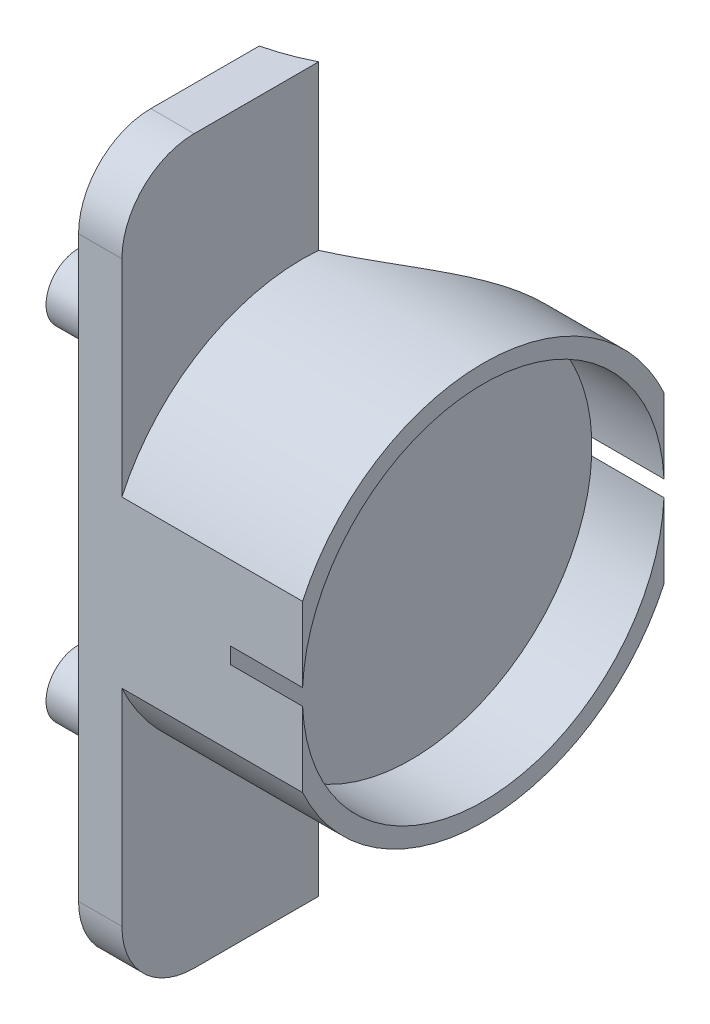
ISO-10303-21;
HEADER;
FILE_DESCRIPTION(('STEP AP214'),'2;1');
FILE_NAME('part.step','',(''),(''),'','','');
FILE_SCHEMA(('AUTOMOTIVE_DESIGN { 1 0 10303 214 1 1 1 1 }'));
ENDSEC;
DATA;
#1=APPLICATION_CONTEXT('core data for automotive mechanical design processes');
#2=APPLICATION_PROTOCOL_DEFINITION('international standard','automotive_design',2000,#1);
#3=PRODUCT_CONTEXT('',#1,'mechanical');
#4=PRODUCT('Part','Part','',(#3));
#5=PRODUCT_RELATED_PRODUCT_CATEGORY('part','',(#4));
#6=PRODUCT_DEFINITION_FORMATION('','',#4);
#7=PRODUCT_DEFINITION_CONTEXT('part definition',#1,'design');
#8=PRODUCT_DEFINITION('design','',#6,#7);
#9=PRODUCT_DEFINITION_SHAPE('','',#8);
#10=(LENGTH_UNIT() NAMED_UNIT(*) SI_UNIT(.MILLI.,.METRE.));
#11=(NAMED_UNIT(*) PLANE_ANGLE_UNIT() SI_UNIT($,.RADIAN.));
#12=(NAMED_UNIT(*) SI_UNIT($,.STERADIAN.) SOLID_ANGLE_UNIT());
#13=UNCERTAINTY_MEASURE_WITH_UNIT(LENGTH_MEASURE(1.E-05),#10,'distance_accuracy_value','');
#14=(GEOMETRIC_REPRESENTATION_CONTEXT(3) GLOBAL_UNCERTAINTY_ASSIGNED_CONTEXT((#13)) GLOBAL_UNIT_ASSIGNED_CONTEXT((#10,
#11,#12)) REPRESENTATION_CONTEXT('',''));
#15=CARTESIAN_POINT('',(0.,0.,0.));
#16=DIRECTION('',(0.,0.,1.));
#17=DIRECTION('',(1.,0.,0.));
#18=AXIS2_PLACEMENT_3D('',#15,#16,#17);
#19=CARTESIAN_POINT('',(6.2,10.,5.));
#20=DIRECTION('',(0.,-1.,0.));
#21=DIRECTION('',(0.,0.,-1.));
#22=AXIS2_PLACEMENT_3D('',#19,#20,#21);
#23=PLANE('',#22);
#24=DIRECTION('',(0.,0.,1.));
#25=VECTOR('',#24,1.);
#26=CARTESIAN_POINT('',(1.2,10.,5.));
#27=LINE('',#26,#25);
#28=CARTESIAN_POINT('',(1.2,10.,-0.442256837947266));
#29=VERTEX_POINT('',#28);
#30=CARTESIAN_POINT('',(1.2,10.,3.));
#31=VERTEX_POINT('',#30);
#32=EDGE_CURVE('E202',#29,#31,#27,.T.);
#33=ORIENTED_EDGE('',*,*,#32,.F.);
#34=CARTESIAN_POINT('',(-1.28905505766208,10.,-5.34680624843615));
#35=DIRECTION('',(0.,1.,0.));
#36=DIRECTION('',(0.,0.,-1.));
#37=AXIS2_PLACEMENT_3D('',#34,#35,#36);
#38=CIRCLE('',#37,5.5);
#39=CARTESIAN_POINT('',(0.,10.,0.));
#40=VERTEX_POINT('',#39);
#41=EDGE_CURVE('E216',#40,#29,#38,.T.);
#42=ORIENTED_EDGE('',*,*,#41,.F.);
#43=DIRECTION('',(0.,0.,1.));
#44=VECTOR('',#43,1.);
#45=CARTESIAN_POINT('',(0.,10.,5.));
#46=LINE('',#45,#44);
#47=CARTESIAN_POINT('',(0.,10.,3.));
#48=VERTEX_POINT('',#47);
#49=EDGE_CURVE('E241',#40,#48,#46,.T.);
#50=ORIENTED_EDGE('',*,*,#49,.T.);
#51=DIRECTION('',(-1.,0.,0.));
#52=VECTOR('',#51,1.);
#53=CARTESIAN_POINT('',(6.2,10.,3.));
#54=LINE('',#53,#52);
#55=EDGE_CURVE('E284',#48,#31,#54,.F.);
#56=ORIENTED_EDGE('',*,*,#55,.T.);
#57=EDGE_LOOP('',(#33,#42,#50,#56));
#58=FACE_BOUND('',#57,.T.);
#59=ADVANCED_FACE('F45',(#58),#23,.F.);
#60=CARTESIAN_POINT('',(6.2,-10.,5.));
#61=DIRECTION('',(0.,1.,0.));
#62=DIRECTION('',(0.,0.,1.));
#63=AXIS2_PLACEMENT_3D('',#60,#61,#62);
#64=PLANE('',#63);
#65=DIRECTION('',(0.,0.,-1.));
#66=VECTOR('',#65,1.);
#67=CARTESIAN_POINT('',(1.2,-10.,5.));
#68=LINE('',#67,#66);
#69=CARTESIAN_POINT('',(1.2,-10.,3.));
#70=VERTEX_POINT('',#69);
#71=CARTESIAN_POINT('',(1.2,-10.,-0.442256837947265));
#72=VERTEX_POINT('',#71);
#73=EDGE_CURVE('E75',#70,#72,#68,.T.);
#74=ORIENTED_EDGE('',*,*,#73,.F.);
#75=DIRECTION('',(-1.,0.,0.));
#76=VECTOR('',#75,1.);
#77=CARTESIAN_POINT('',(6.2,-10.,3.));
#78=LINE('',#77,#76);
#79=CARTESIAN_POINT('',(0.,-10.,3.));
#80=VERTEX_POINT('',#79);
#81=EDGE_CURVE('E288',#70,#80,#78,.T.);
#82=ORIENTED_EDGE('',*,*,#81,.T.);
#83=DIRECTION('',(0.,0.,-1.));
#84=VECTOR('',#83,1.);
#85=CARTESIAN_POINT('',(0.,-10.,5.));
#86=LINE('',#85,#84);
#87=CARTESIAN_POINT('',(0.,-10.,0.));
#88=VERTEX_POINT('',#87);
#89=EDGE_CURVE('E268',#80,#88,#86,.T.);
#90=ORIENTED_EDGE('',*,*,#89,.T.);
#91=CARTESIAN_POINT('',(-1.28905505766208,-10.,-5.34680624843615));
#92=DIRECTION('',(0.,1.,0.));
#93=DIRECTION('',(0.,0.,-1.));
#94=AXIS2_PLACEMENT_3D('',#91,#92,#93);
#95=CIRCLE('',#94,5.5);
#96=EDGE_CURVE('E220',#88,#72,#95,.T.);
#97=ORIENTED_EDGE('',*,*,#96,.T.);
#98=EDGE_LOOP('',(#74,#82,#90,#97));
#99=FACE_BOUND('',#98,.T.);
#100=ADVANCED_FACE('F342',(#99),#64,.F.);
#101=CARTESIAN_POINT('',(6.2,8.,3.));
#102=DIRECTION('',(-1.,0.,0.));
#103=DIRECTION('',(0.,0.,1.));
#104=AXIS2_PLACEMENT_3D('',#101,#102,#103);
#105=CYLINDRICAL_SURFACE('',#104,2.);
#106=DIRECTION('',(-1.,0.,0.));
#107=VECTOR('',#106,1.);
#108=CARTESIAN_POINT('',(6.2,8.,5.));
#109=LINE('',#108,#107);
#110=CARTESIAN_POINT('',(1.2,8.,5.));
#111=VERTEX_POINT('',#110);
#112=CARTESIAN_POINT('',(0.,8.,5.));
#113=VERTEX_POINT('',#112);
#114=EDGE_CURVE('E274',#111,#113,#109,.T.);
#115=ORIENTED_EDGE('',*,*,#114,.F.);
#116=CARTESIAN_POINT('',(1.2,8.,3.));
#117=DIRECTION('',(1.,0.,0.));
#118=DIRECTION('',(0.,0.,-1.));
#119=AXIS2_PLACEMENT_3D('',#116,#117,#118);
#120=CIRCLE('',#119,2.);
#121=EDGE_CURVE('E191',#111,#31,#120,.F.);
#122=ORIENTED_EDGE('',*,*,#121,.T.);
#123=ORIENTED_EDGE('',*,*,#55,.F.);
#124=CARTESIAN_POINT('',(0.,8.,3.));
#125=DIRECTION('',(1.,0.,0.));
#126=DIRECTION('',(0.,0.,-1.));
#127=AXIS2_PLACEMENT_3D('',#124,#125,#126);
#128=CIRCLE('',#127,2.);
#129=EDGE_CURVE('E280',#113,#48,#128,.F.);
#130=ORIENTED_EDGE('',*,*,#129,.F.);
#131=EDGE_LOOP('',(#115,#122,#123,#130));
#132=FACE_BOUND('',#131,.T.);
#133=ADVANCED_FACE('F349',(#132),#105,.T.);
#134=CARTESIAN_POINT('',(6.2,-8.,3.));
#135=DIRECTION('',(-1.,0.,0.));
#136=DIRECTION('',(0.,0.,1.));
#137=AXIS2_PLACEMENT_3D('',#134,#135,#136);
#138=CYLINDRICAL_SURFACE('',#137,2.);
#139=ORIENTED_EDGE('',*,*,#81,.F.);
#140=CARTESIAN_POINT('',(1.2,-8.,3.));
#141=DIRECTION('',(1.,0.,0.));
#142=DIRECTION('',(0.,0.,-1.));
#143=AXIS2_PLACEMENT_3D('',#140,#141,#142);
#144=CIRCLE('',#143,2.);
#145=CARTESIAN_POINT('',(1.2,-8.,5.));
#146=VERTEX_POINT('',#145);
#147=EDGE_CURVE('E213',#70,#146,#144,.F.);
#148=ORIENTED_EDGE('',*,*,#147,.T.);
#149=DIRECTION('',(-1.,0.,0.));
#150=VECTOR('',#149,1.);
#151=CARTESIAN_POINT('',(6.2,-8.,5.));
#152=LINE('',#151,#150);
#153=CARTESIAN_POINT('',(0.,-8.,5.));
#154=VERTEX_POINT('',#153);
#155=EDGE_CURVE('E181',#154,#146,#152,.F.);
#156=ORIENTED_EDGE('',*,*,#155,.F.);
#157=CARTESIAN_POINT('',(0.,-8.,3.));
#158=DIRECTION('',(1.,0.,0.));
#159=DIRECTION('',(0.,0.,-1.));
#160=AXIS2_PLACEMENT_3D('',#157,#158,#159);
#161=CIRCLE('',#160,2.);
#162=EDGE_CURVE('E277',#80,#154,#161,.F.);
#163=ORIENTED_EDGE('',*,*,#162,.F.);
#164=EDGE_LOOP('',(#139,#148,#156,#163));
#165=FACE_BOUND('',#164,.T.);
#166=ADVANCED_FACE('F47',(#165),#138,.T.);
#167=CARTESIAN_POINT('',(6.2,-10.,-5.));
#168=DIRECTION('',(0.,0.,1.));
#169=DIRECTION('',(1.,0.,0.));
#170=AXIS2_PLACEMENT_3D('',#167,#168,#169);
#171=PLANE('',#170);
#172=DIRECTION('',(0.,1.,0.));
#173=VECTOR('',#172,1.);
#174=CARTESIAN_POINT('',(6.2,-10.,-5.));
#175=LINE('',#174,#173);
#176=CARTESIAN_POINT('',(6.2,-2.29128784747792,-5.));
#177=VERTEX_POINT('',#176);
#178=CARTESIAN_POINT('',(6.2,-0.223662692463442,-5.));
#179=VERTEX_POINT('',#178);
#180=EDGE_CURVE('E260',#177,#179,#175,.T.);
#181=ORIENTED_EDGE('',*,*,#180,.F.);
#182=DIRECTION('',(1.,0.,0.));
#183=VECTOR('',#182,1.);
#184=CARTESIAN_POINT('',(1.2,-2.29128784747792,-5.));
#185=LINE('',#184,#183);
#186=CARTESIAN_POINT('',(4.2,-2.29128784747792,-5.));
#187=VERTEX_POINT('',#186);
#188=EDGE_CURVE('E175',#187,#177,#185,.T.);
#189=ORIENTED_EDGE('',*,*,#188,.F.);
#190=DIRECTION('',(0.,1.,0.));
#191=VECTOR('',#190,1.);
#192=CARTESIAN_POINT('',(4.2,-10.,-5.));
#193=LINE('',#192,#191);
#194=CARTESIAN_POINT('',(4.2,-0.223662692463417,-5.));
#195=VERTEX_POINT('',#194);
#196=EDGE_CURVE('E229',#187,#195,#193,.T.);
#197=ORIENTED_EDGE('',*,*,#196,.T.);
#198=DIRECTION('',(-1.,0.,0.));
#199=VECTOR('',#198,1.);
#200=CARTESIAN_POINT('',(6.200012,-0.22366269246348,-5.));
#201=LINE('',#200,#199);
#202=EDGE_CURVE('E296',#179,#195,#201,.T.);
#203=ORIENTED_EDGE('',*,*,#202,.F.);
#204=EDGE_LOOP('',(#181,#189,#197,#203));
#205=FACE_BOUND('',#204,.T.);
#206=ADVANCED_FACE('F359',(#205),#171,.F.);
#207=CARTESIAN_POINT('',(6.2,-10.,5.));
#208=DIRECTION('',(0.,0.,-1.));
#209=DIRECTION('',(-1.,0.,0.));
#210=AXIS2_PLACEMENT_3D('',#207,#208,#209);
#211=PLANE('',#210);
#212=DIRECTION('',(0.,-1.,0.));
#213=VECTOR('',#212,1.);
#214=CARTESIAN_POINT('',(1.2,-10.,5.));
#215=LINE('',#214,#213);
#216=CARTESIAN_POINT('',(1.2,-2.29128784747792,5.));
#217=VERTEX_POINT('',#216);
#218=EDGE_CURVE('E161',#217,#146,#215,.T.);
#219=ORIENTED_EDGE('',*,*,#218,.F.);
#220=DIRECTION('',(1.,0.,0.));
#221=VECTOR('',#220,1.);
#222=CARTESIAN_POINT('',(1.2,-2.29128784747792,5.));
#223=LINE('',#222,#221);
#224=CARTESIAN_POINT('',(6.2,-2.29128784747792,5.));
#225=VERTEX_POINT('',#224);
#226=EDGE_CURVE('E168',#217,#225,#223,.T.);
#227=ORIENTED_EDGE('',*,*,#226,.T.);
#228=DIRECTION('',(0.,-1.,0.));
#229=VECTOR('',#228,1.);
#230=CARTESIAN_POINT('',(6.2,-10.,5.));
#231=LINE('',#230,#229);
#232=CARTESIAN_POINT('',(6.2,-0.223662692463465,5.));
#233=VERTEX_POINT('',#232);
#234=EDGE_CURVE('E259',#233,#225,#231,.T.);
#235=ORIENTED_EDGE('',*,*,#234,.F.);
#236=DIRECTION('',(-1.,0.,0.));
#237=VECTOR('',#236,1.);
#238=CARTESIAN_POINT('',(6.200012,-0.223662692463502,5.));
#239=LINE('',#238,#237);
#240=CARTESIAN_POINT('',(4.2,-0.223662692463484,5.));
#241=VERTEX_POINT('',#240);
#242=EDGE_CURVE('E300',#241,#233,#239,.F.);
#243=ORIENTED_EDGE('',*,*,#242,.F.);
#244=DIRECTION('',(0.,1.,0.));
#245=VECTOR('',#244,1.);
#246=CARTESIAN_POINT('',(4.2,0.,5.));
#247=LINE('',#246,#245);
#248=CARTESIAN_POINT('',(4.2,0.223662692463484,5.));
#249=VERTEX_POINT('',#248);
#250=EDGE_CURVE('E254',#249,#241,#247,.F.);
#251=ORIENTED_EDGE('',*,*,#250,.F.);
#252=DIRECTION('',(-1.,0.,0.));
#253=VECTOR('',#252,1.);
#254=CARTESIAN_POINT('',(6.200012,0.223662692463502,5.));
#255=LINE('',#254,#253);
#256=CARTESIAN_POINT('',(6.2,0.223662692463465,5.));
#257=VERTEX_POINT('',#256);
#258=EDGE_CURVE('E301',#257,#249,#255,.T.);
#259=ORIENTED_EDGE('',*,*,#258,.F.);
#260=CARTESIAN_POINT('',(6.2,2.29128784747792,5.));
#261=VERTEX_POINT('',#260);
#262=EDGE_CURVE('E255',#261,#257,#231,.T.);
#263=ORIENTED_EDGE('',*,*,#262,.F.);
#264=DIRECTION('',(1.,0.,0.));
#265=VECTOR('',#264,1.);
#266=CARTESIAN_POINT('',(1.2,2.29128784747792,5.));
#267=LINE('',#266,#265);
#268=CARTESIAN_POINT('',(1.2,2.29128784747792,5.));
#269=VERTEX_POINT('',#268);
#270=EDGE_CURVE('E193',#269,#261,#267,.T.);
#271=ORIENTED_EDGE('',*,*,#270,.F.);
#272=DIRECTION('',(0.,-1.,0.));
#273=VECTOR('',#272,1.);
#274=CARTESIAN_POINT('',(1.2,2.29128784747792,5.));
#275=LINE('',#274,#273);
#276=EDGE_CURVE('E205',#111,#269,#275,.T.);
#277=ORIENTED_EDGE('',*,*,#276,.F.);
#278=ORIENTED_EDGE('',*,*,#114,.T.);
#279=DIRECTION('',(0.,-1.,0.));
#280=VECTOR('',#279,1.);
#281=CARTESIAN_POINT('',(0.,-10.,5.));
#282=LINE('',#281,#280);
#283=EDGE_CURVE('E265',#113,#154,#282,.T.);
#284=ORIENTED_EDGE('',*,*,#283,.T.);
#285=ORIENTED_EDGE('',*,*,#155,.T.);
#286=EDGE_LOOP('',(#219,#227,#235,#243,#251,#259,#263,#271,#277,#278,#284,#285));
#287=FACE_BOUND('',#286,.T.);
#288=ADVANCED_FACE('F178',(#287),#211,.F.);
#289=CARTESIAN_POINT('',(4.2,0.223662692463461,-5.));
#290=VERTEX_POINT('',#289);
#291=CARTESIAN_POINT('',(4.2,2.29128784747792,-5.));
#292=VERTEX_POINT('',#291);
#293=EDGE_CURVE('E224',#290,#292,#193,.T.);
#294=ORIENTED_EDGE('',*,*,#293,.T.);
#295=DIRECTION('',(1.,0.,0.));
#296=VECTOR('',#295,1.);
#297=CARTESIAN_POINT('',(1.2,2.29128784747792,-5.));
#298=LINE('',#297,#296);
#299=CARTESIAN_POINT('',(6.2,2.29128784747792,-5.));
#300=VERTEX_POINT('',#299);
#301=EDGE_CURVE('E196',#292,#300,#298,.T.);
#302=ORIENTED_EDGE('',*,*,#301,.T.);
#303=CARTESIAN_POINT('',(6.2,0.223662692463442,-5.));
#304=VERTEX_POINT('',#303);
#305=EDGE_CURVE('E258',#304,#300,#175,.T.);
#306=ORIENTED_EDGE('',*,*,#305,.F.);
#307=DIRECTION('',(-1.,0.,0.));
#308=VECTOR('',#307,1.);
#309=CARTESIAN_POINT('',(6.200012,0.22366269246348,-5.));
#310=LINE('',#309,#308);
#311=EDGE_CURVE('E236',#290,#304,#310,.F.);
#312=ORIENTED_EDGE('',*,*,#311,.F.);
#313=EDGE_LOOP('',(#294,#302,#306,#312));
#314=FACE_BOUND('',#313,.T.);
#315=ADVANCED_FACE('F392',(#314),#171,.F.);
#316=CARTESIAN_POINT('',(6.2,0.,0.));
#317=DIRECTION('',(1.,0.,0.));
#318=DIRECTION('',(0.,0.,-1.));
#319=AXIS2_PLACEMENT_3D('',#316,#317,#318);
#320=PLANE('',#319);
#321=CARTESIAN_POINT('',(6.2,0.,0.));
#322=DIRECTION('',(-1.,0.,0.));
#323=DIRECTION('',(0.,0.,-1.));
#324=AXIS2_PLACEMENT_3D('',#321,#322,#323);
#325=CIRCLE('',#324,5.5);
#326=EDGE_CURVE('E165',#177,#225,#325,.T.);
#327=ORIENTED_EDGE('',*,*,#326,.F.);
#328=ORIENTED_EDGE('',*,*,#180,.T.);
#329=CARTESIAN_POINT('',(6.2,0.,0.));
#330=DIRECTION('',(1.,0.,0.));
#331=DIRECTION('',(0.,0.,-1.));
#332=AXIS2_PLACEMENT_3D('',#329,#330,#331);
#333=CIRCLE('',#332,5.005);
#334=EDGE_CURVE('E295',#179,#233,#333,.F.);
#335=ORIENTED_EDGE('',*,*,#334,.T.);
#336=ORIENTED_EDGE('',*,*,#234,.T.);
#337=EDGE_LOOP('',(#327,#328,#335,#336));
#338=FACE_BOUND('',#337,.T.);
#339=ADVANCED_FACE('F409',(#338),#320,.T.);
#340=CARTESIAN_POINT('',(6.2,0.,0.));
#341=DIRECTION('',(-1.,0.,0.));
#342=DIRECTION('',(0.,0.,-1.));
#343=AXIS2_PLACEMENT_3D('',#340,#341,#342);
#344=CIRCLE('',#343,5.5);
#345=EDGE_CURVE('E189',#261,#300,#344,.T.);
#346=ORIENTED_EDGE('',*,*,#345,.F.);
#347=ORIENTED_EDGE('',*,*,#262,.T.);
#348=EDGE_CURVE('E291',#257,#304,#333,.F.);
#349=ORIENTED_EDGE('',*,*,#348,.T.);
#350=ORIENTED_EDGE('',*,*,#305,.T.);
#351=EDGE_LOOP('',(#346,#347,#349,#350));
#352=FACE_BOUND('',#351,.T.);
#353=ADVANCED_FACE('F423',(#352),#320,.T.);
#354=CARTESIAN_POINT('',(0.,0.,0.));
#355=DIRECTION('',(1.,0.,0.));
#356=DIRECTION('',(0.,0.,-1.));
#357=AXIS2_PLACEMENT_3D('',#354,#355,#356);
#358=PLANE('',#357);
#359=CARTESIAN_POINT('',(0.,-4.75,3.));
#360=DIRECTION('',(1.,0.,0.));
#361=DIRECTION('',(0.,0.,-1.));
#362=AXIS2_PLACEMENT_3D('',#359,#360,#361);
#363=CIRCLE('',#362,0.9);
#364=CARTESIAN_POINT('',(0.,-4.75,2.1));
#365=VERTEX_POINT('',#364);
#366=EDGE_CURVE('E242',#365,#365,#363,.T.);
#367=ORIENTED_EDGE('',*,*,#366,.T.);
#368=EDGE_LOOP('',(#367));
#369=FACE_BOUND('',#368,.T.);
#370=CARTESIAN_POINT('',(0.,4.75,3.));
#371=DIRECTION('',(1.,0.,0.));
#372=DIRECTION('',(0.,0.,1.));
#373=AXIS2_PLACEMENT_3D('',#370,#371,#372);
#374=CIRCLE('',#373,0.9);
#375=CARTESIAN_POINT('',(0.,4.75,3.9));
#376=VERTEX_POINT('',#375);
#377=EDGE_CURVE('E246',#376,#376,#374,.T.);
#378=ORIENTED_EDGE('',*,*,#377,.T.);
#379=EDGE_LOOP('',(#378));
#380=FACE_BOUND('',#379,.T.);
#381=ORIENTED_EDGE('',*,*,#49,.F.);
#382=DIRECTION('',(0.,1.,0.));
#383=VECTOR('',#382,1.);
#384=CARTESIAN_POINT('',(0.,-10.,0.));
#385=LINE('',#384,#383);
#386=EDGE_CURVE('E225',#88,#40,#385,.T.);
#387=ORIENTED_EDGE('',*,*,#386,.F.);
#388=ORIENTED_EDGE('',*,*,#89,.F.);
#389=ORIENTED_EDGE('',*,*,#162,.T.);
#390=ORIENTED_EDGE('',*,*,#283,.F.);
#391=ORIENTED_EDGE('',*,*,#129,.T.);
#392=EDGE_LOOP('',(#381,#387,#388,#389,#390,#391));
#393=FACE_BOUND('',#392,.T.);
#394=ADVANCED_FACE('F377',(#369,#380,#393),#358,.F.);
#395=CARTESIAN_POINT('',(-2.,4.75,3.));
#396=DIRECTION('',(1.,0.,0.));
#397=DIRECTION('',(0.,0.,-1.));
#398=AXIS2_PLACEMENT_3D('',#395,#396,#397);
#399=CYLINDRICAL_SURFACE('',#398,0.9);
#400=CARTESIAN_POINT('',(-2.,4.75,3.));
#401=DIRECTION('',(1.,0.,0.));
#402=DIRECTION('',(0.,0.,1.));
#403=AXIS2_PLACEMENT_3D('',#400,#401,#402);
#404=CIRCLE('',#403,0.9);
#405=CARTESIAN_POINT('',(-2.,4.75,3.9));
#406=VERTEX_POINT('',#405);
#407=EDGE_CURVE('E250',#406,#406,#404,.T.);
#408=ORIENTED_EDGE('',*,*,#407,.T.);
#409=EDGE_LOOP('',(#408));
#410=FACE_BOUND('',#409,.T.);
#411=ORIENTED_EDGE('',*,*,#377,.F.);
#412=EDGE_LOOP('',(#411));
#413=FACE_BOUND('',#412,.T.);
#414=ADVANCED_FACE('F433',(#410,#413),#399,.T.);
#415=CARTESIAN_POINT('',(-2.,4.75,3.));
#416=DIRECTION('',(-1.,0.,0.));
#417=DIRECTION('',(0.,0.,1.));
#418=AXIS2_PLACEMENT_3D('',#415,#416,#417);
#419=PLANE('',#418);
#420=ORIENTED_EDGE('',*,*,#407,.F.);
#421=EDGE_LOOP('',(#420));
#422=FACE_BOUND('',#421,.T.);
#423=ADVANCED_FACE('F430',(#422),#419,.T.);
#424=CARTESIAN_POINT('',(-2.,-4.75,3.));
#425=DIRECTION('',(1.,0.,0.));
#426=DIRECTION('',(0.,0.,-1.));
#427=AXIS2_PLACEMENT_3D('',#424,#425,#426);
#428=CYLINDRICAL_SURFACE('',#427,0.9);
#429=CARTESIAN_POINT('',(-2.,-4.75,3.));
#430=DIRECTION('',(1.,0.,0.));
#431=DIRECTION('',(0.,0.,-1.));
#432=AXIS2_PLACEMENT_3D('',#429,#430,#431);
#433=CIRCLE('',#432,0.9);
#434=CARTESIAN_POINT('',(-2.,-4.75,2.1));
#435=VERTEX_POINT('',#434);
#436=EDGE_CURVE('E237',#435,#435,#433,.T.);
#437=ORIENTED_EDGE('',*,*,#436,.T.);
#438=EDGE_LOOP('',(#437));
#439=FACE_BOUND('',#438,.T.);
#440=ORIENTED_EDGE('',*,*,#366,.F.);
#441=EDGE_LOOP('',(#440));
#442=FACE_BOUND('',#441,.T.);
#443=ADVANCED_FACE('F446',(#439,#442),#428,.T.);
#444=CARTESIAN_POINT('',(-2.,-4.75,3.));
#445=DIRECTION('',(1.,0.,0.));
#446=DIRECTION('',(0.,0.,-1.));
#447=AXIS2_PLACEMENT_3D('',#444,#445,#446);
#448=PLANE('',#447);
#449=ORIENTED_EDGE('',*,*,#436,.F.);
#450=EDGE_LOOP('',(#449));
#451=FACE_BOUND('',#450,.T.);
#452=ADVANCED_FACE('F448',(#451),#448,.F.);
#453=CARTESIAN_POINT('',(4.2,0.,0.));
#454=DIRECTION('',(1.,0.,0.));
#455=DIRECTION('',(0.,0.,-1.));
#456=AXIS2_PLACEMENT_3D('',#453,#454,#455);
#457=PLANE('',#456);
#458=ORIENTED_EDGE('',*,*,#250,.T.);
#459=CARTESIAN_POINT('',(4.2,0.,0.));
#460=DIRECTION('',(1.,0.,0.));
#461=DIRECTION('',(0.,0.,-1.));
#462=AXIS2_PLACEMENT_3D('',#459,#460,#461);
#463=CIRCLE('',#462,5.005);
#464=EDGE_CURVE('E228',#241,#195,#463,.T.);
#465=ORIENTED_EDGE('',*,*,#464,.T.);
#466=DIRECTION('',(0.,1.,0.));
#467=VECTOR('',#466,1.);
#468=CARTESIAN_POINT('',(4.2,0.,-5.));
#469=LINE('',#468,#467);
#470=EDGE_CURVE('E308',#195,#290,#469,.T.);
#471=ORIENTED_EDGE('',*,*,#470,.T.);
#472=EDGE_CURVE('E232',#290,#249,#463,.T.);
#473=ORIENTED_EDGE('',*,*,#472,.T.);
#474=EDGE_LOOP('',(#458,#465,#471,#473));
#475=FACE_BOUND('',#474,.T.);
#476=ADVANCED_FACE('F397',(#475),#457,.T.);
#477=CARTESIAN_POINT('',(6.200012,0.,0.));
#478=DIRECTION('',(-1.,0.,0.));
#479=DIRECTION('',(0.,0.,1.));
#480=AXIS2_PLACEMENT_3D('',#477,#478,#479);
#481=CYLINDRICAL_SURFACE('',#480,5.005);
#482=ORIENTED_EDGE('',*,*,#242,.T.);
#483=ORIENTED_EDGE('',*,*,#334,.F.);
#484=ORIENTED_EDGE('',*,*,#202,.T.);
#485=ORIENTED_EDGE('',*,*,#464,.F.);
#486=EDGE_LOOP('',(#482,#483,#484,#485));
#487=FACE_BOUND('',#486,.T.);
#488=ADVANCED_FACE('F406',(#487),#481,.F.);
#489=ORIENTED_EDGE('',*,*,#258,.T.);
#490=ORIENTED_EDGE('',*,*,#472,.F.);
#491=ORIENTED_EDGE('',*,*,#311,.T.);
#492=ORIENTED_EDGE('',*,*,#348,.F.);
#493=EDGE_LOOP('',(#489,#490,#491,#492));
#494=FACE_BOUND('',#493,.T.);
#495=ADVANCED_FACE('F400',(#494),#481,.F.);
#496=CARTESIAN_POINT('',(-1.28905505766208,-10.,-5.34680624843615));
#497=DIRECTION('',(0.,1.,0.));
#498=DIRECTION('',(0.,0.,1.));
#499=AXIS2_PLACEMENT_3D('',#496,#497,#498);
#500=CYLINDRICAL_SURFACE('',#499,5.5);
#501=ORIENTED_EDGE('',*,*,#196,.F.);
#502=CARTESIAN_POINT('',(4.2,-2.29128784747791,-5.));
#503=CARTESIAN_POINT('',(4.19639911606063,-2.41514441206533,-4.94326065182703));
#504=CARTESIAN_POINT('',(4.19165408675673,-2.5368688620811,-4.88189332030052));
#505=CARTESIAN_POINT('',(4.17891156036083,-2.77536600692024,-4.75035255742247));
#506=CARTESIAN_POINT('',(4.17091234097071,-2.89213604339779,-4.68017447655235));
#507=CARTESIAN_POINT('',(4.15065034524994,-3.12045261933761,-4.53116517068093));
#508=CARTESIAN_POINT('',(4.13836721429123,-3.23197128367225,-4.45229388674637));
#509=CARTESIAN_POINT('',(4.10849855879096,-3.44838336341577,-4.28686292565031));
#510=CARTESIAN_POINT('',(4.09091394946905,-3.5532779185991,-4.20030457736163));
#511=CARTESIAN_POINT('',(4.04928937238056,-3.75618662861854,-4.01989788032957));
#512=CARTESIAN_POINT('',(4.02521830489514,-3.85416468854982,-3.92601600096326));
#513=CARTESIAN_POINT('',(3.9696462436318,-4.04191864165799,-3.73243475906715));
#514=CARTESIAN_POINT('',(3.93814621962508,-4.13169560328063,-3.63273615712595));
#515=CARTESIAN_POINT('',(3.86693069958835,-4.30214969098083,-3.42915124816399));
#516=CARTESIAN_POINT('',(3.82724081213394,-4.38285399909117,-3.32527878853881));
#517=CARTESIAN_POINT('',(3.73889656550081,-4.53499044915429,-3.1146008996727));
#518=CARTESIAN_POINT('',(3.69024329679855,-4.60642371721306,-3.0077958285541));
#519=CARTESIAN_POINT('',(3.58829428334253,-4.73383231164843,-2.80251761990579));
#520=CARTESIAN_POINT('',(3.53579731080395,-4.79061761505373,-2.70414911130064));
#521=CARTESIAN_POINT('',(3.42289027552659,-4.89630142310328,-2.50772191059375));
#522=CARTESIAN_POINT('',(3.36248061786235,-4.94520033119047,-2.40966320289534));
#523=CARTESIAN_POINT('',(3.23377233422721,-5.0353640231394,-2.21508924292108));
#524=CARTESIAN_POINT('',(3.16546665553408,-5.07662189511047,-2.11857545953252));
#525=CARTESIAN_POINT('',(3.02127214307179,-5.15185649601452,-1.92842711075316));
#526=CARTESIAN_POINT('',(2.94538339664754,-5.18583330879959,-1.83479251221497));
#527=CARTESIAN_POINT('',(2.7897603511102,-5.24579415046163,-1.65536000423883));
#528=CARTESIAN_POINT('',(2.71032019832962,-5.27205331933754,-1.56939812319924));
#529=CARTESIAN_POINT('',(2.54525836887012,-5.31903127361253,-1.40195294141554));
#530=CARTESIAN_POINT('',(2.45963417711074,-5.33974778848752,-1.32047148688428));
#531=CARTESIAN_POINT('',(2.28277754542244,-5.37628886312016,-1.16278413440108));
#532=CARTESIAN_POINT('',(2.19154839430829,-5.3921162594063,-1.08657519747679));
#533=CARTESIAN_POINT('',(2.00394296008785,-5.41959855023239,-0.939954564700514));
#534=CARTESIAN_POINT('',(1.907566235187,-5.4312530859699,-0.869543367766487));
#535=CARTESIAN_POINT('',(1.71144292928817,-5.45096684252853,-0.735850652898027));
#536=CARTESIAN_POINT('',(1.61175439014052,-5.45906967382548,-0.672490220439833));
#537=CARTESIAN_POINT('',(1.40862028559525,-5.47252117817277,-0.552385931099026));
#538=CARTESIAN_POINT('',(1.30518459787287,-5.4778765979361,-0.495626133213326));
#539=CARTESIAN_POINT('',(1.2,-5.48219015442632,-0.442256837947265));
#540=B_SPLINE_CURVE_WITH_KNOTS('',3,(#502,#503,#504,#505,#506,#507,#508,#509,#510,#511,#512,
#513,#514,#515,#516,#517,#518,#519,#520,#521,#522,#523,#524,#525,#526,#527,#528,#529,#530,#531,
#532,#533,#534,#535,#536,#537,#538,#539),.UNSPECIFIED.,.F.,.F.,(4,2,2,2,2,2,2,2,2,2,2,2,2,2,2,2,
2,2,4),(0.,0.408776823480697,0.817770276405929,1.22873411301255,1.63962704354572,
2.05252619983313,2.46537148633539,2.87694490989394,3.28846829484614,3.66335962401341,
4.03823176884301,4.41344137485527,4.78864665954643,5.14813868883937,5.50777775777917,
5.86720778069779,6.22666870170554,6.58158301601722,6.93562155806596),.UNSPECIFIED.);
#541=CARTESIAN_POINT('',(1.2,-5.48219015442632,-0.442256837947266));
#542=VERTEX_POINT('',#541);
#543=EDGE_CURVE('E11',#187,#542,#540,.T.);
#544=ORIENTED_EDGE('',*,*,#543,.T.);
#545=DIRECTION('',(0.,1.,0.));
#546=VECTOR('',#545,1.);
#547=CARTESIAN_POINT('',(1.2,-10.,-0.442256837947266));
#548=LINE('',#547,#546);
#549=EDGE_CURVE('E60',#72,#542,#548,.T.);
#550=ORIENTED_EDGE('',*,*,#549,.F.);
#551=ORIENTED_EDGE('',*,*,#96,.F.);
#552=ORIENTED_EDGE('',*,*,#386,.T.);
#553=ORIENTED_EDGE('',*,*,#41,.T.);
#554=DIRECTION('',(0.,1.,0.));
#555=VECTOR('',#554,1.);
#556=CARTESIAN_POINT('',(1.2,-10.,-0.442256837947266));
#557=LINE('',#556,#555);
#558=CARTESIAN_POINT('',(1.2,5.48219015442632,-0.442256837947266));
#559=VERTEX_POINT('',#558);
#560=EDGE_CURVE('E312',#559,#29,#557,.T.);
#561=ORIENTED_EDGE('',*,*,#560,.F.);
#562=CARTESIAN_POINT('',(1.2,5.48219015442632,-0.442256837947266));
#563=CARTESIAN_POINT('',(1.31940355614053,5.47729032095333,-0.502833734109367));
#564=CARTESIAN_POINT('',(1.43655464475448,5.4710521618508,-0.567790157103893));
#565=CARTESIAN_POINT('',(1.66569659727166,5.45494978000197,-0.705976545050296));
#566=CARTESIAN_POINT('',(1.77768452229931,5.4450835201282,-0.779211142049095));
#567=CARTESIAN_POINT('',(1.99618010471062,5.42072638440075,-0.933732265275565));
#568=CARTESIAN_POINT('',(2.10266198393173,5.40621570487054,-1.01505222457128));
#569=CARTESIAN_POINT('',(2.30886439910151,5.37158155929953,-1.18474007031812));
#570=CARTESIAN_POINT('',(2.40858619463306,5.35145914246725,-1.27310663708446));
#571=CARTESIAN_POINT('',(2.60105049797357,5.30450120574623,-1.45645545857894));
#572=CARTESIAN_POINT('',(2.69375574108141,5.27763272529763,-1.55146849287326));
#573=CARTESIAN_POINT('',(2.87095123472273,5.21631547293176,-1.74656898770082));
#574=CARTESIAN_POINT('',(2.95544247152857,5.18186761271081,-1.84665583680971));
#575=CARTESIAN_POINT('',(3.11542955791459,5.10472851993272,-2.05025834347273));
#576=CARTESIAN_POINT('',(3.19095117544962,5.06206187215194,-2.15376303071626));
#577=CARTESIAN_POINT('',(3.33290638947443,4.96786208449778,-2.36294212111495));
#578=CARTESIAN_POINT('',(3.39934097836657,4.91632991422592,-2.46861628588752));
#579=CARTESIAN_POINT('',(3.51772946501802,4.80887529358165,-2.67146999025806));
#580=CARTESIAN_POINT('',(3.57043433126933,4.75369874848616,-2.76860778073558));
#581=CARTESIAN_POINT('',(3.66822135758507,4.63564523102497,-2.96203089527589));
#582=CARTESIAN_POINT('',(3.71330388506445,4.57276863007243,-3.05831626021547));
#583=CARTESIAN_POINT('',(3.79617071749451,4.43940407740319,-3.24888146183955));
#584=CARTESIAN_POINT('',(3.83394786582388,4.36890876642162,-3.34315925219727));
#585=CARTESIAN_POINT('',(3.90260973367607,4.22066889998903,-3.52846031765793));
#586=CARTESIAN_POINT('',(3.9334944480757,4.14292433914966,-3.61948359034173));
#587=CARTESIAN_POINT('',(3.98829582347218,3.9825977073312,-3.79508989264495));
#588=CARTESIAN_POINT('',(4.01236392145904,3.90017964798406,-3.87977580075819));
#589=CARTESIAN_POINT('',(4.0551695317002,3.7292927861854,-4.04431092135854));
#590=CARTESIAN_POINT('',(4.07390486657552,3.64082153043513,-4.12415814775802));
#591=CARTESIAN_POINT('',(4.10672454185558,3.45841747059344,-4.27827040648043));
#592=CARTESIAN_POINT('',(4.12081124715964,3.36448747222442,-4.35253826230004));
#593=CARTESIAN_POINT('',(4.14506418203695,3.17164337604015,-4.49500340391893));
#594=CARTESIAN_POINT('',(4.15522999472494,3.07272874950239,-4.56320004360915));
#595=CARTESIAN_POINT('',(4.17299860369701,2.86277756284336,-4.69800108517503));
#596=CARTESIAN_POINT('',(4.18034861985102,2.75139055412465,-4.76409268767934));
#597=CARTESIAN_POINT('',(4.192138493986,2.52439639540714,-4.88816466255889));
#598=CARTESIAN_POINT('',(4.19658553313883,2.40880041168923,-4.94616476917246));
#599=CARTESIAN_POINT('',(4.2,2.29128784747792,-5.));
#600=B_SPLINE_CURVE_WITH_KNOTS('',3,(#562,#563,#564,#565,#566,#567,#568,#569,#570,#571,#572,
#573,#574,#575,#576,#577,#578,#579,#580,#581,#582,#583,#584,#585,#586,#587,#588,#589,#590,#591,
#592,#593,#594,#595,#596,#597,#598,#599),.UNSPECIFIED.,.F.,.F.,(4,2,2,2,2,2,2,2,2,2,2,2,2,2,2,2,
2,2,4),(0.,0.401878892961849,0.803983780669745,1.20782659979696,1.61159396428974,
2.01737384793722,2.42310494844031,2.82764072518478,3.23213228688802,3.60222940928152,
3.97230868701959,4.34274869173188,4.71318897179351,5.07460380132244,5.43616598633706,
5.79754394908467,6.15896032442426,6.54778037233541,6.93563490374438),.UNSPECIFIED.);
#601=EDGE_CURVE('E318',#559,#292,#600,.T.);
#602=ORIENTED_EDGE('',*,*,#601,.T.);
#603=ORIENTED_EDGE('',*,*,#293,.F.);
#604=ORIENTED_EDGE('',*,*,#470,.F.);
#605=EDGE_LOOP('',(#501,#544,#550,#551,#552,#553,#561,#602,#603,#604));
#606=FACE_BOUND('',#605,.T.);
#607=ADVANCED_FACE('F326',(#606),#500,.F.);
#608=CARTESIAN_POINT('',(1.2,0.,0.));
#609=DIRECTION('',(1.,0.,0.));
#610=DIRECTION('',(0.,0.,-1.));
#611=AXIS2_PLACEMENT_3D('',#608,#609,#610);
#612=CYLINDRICAL_SURFACE('',#611,5.5);
#613=CARTESIAN_POINT('',(1.2,0.,0.));
#614=DIRECTION('',(-1.,0.,0.));
#615=DIRECTION('',(0.,0.,-1.));
#616=AXIS2_PLACEMENT_3D('',#613,#614,#615);
#617=CIRCLE('',#616,5.5);
#618=EDGE_CURVE('E67',#269,#559,#617,.T.);
#619=ORIENTED_EDGE('',*,*,#618,.F.);
#620=ORIENTED_EDGE('',*,*,#270,.T.);
#621=ORIENTED_EDGE('',*,*,#345,.T.);
#622=ORIENTED_EDGE('',*,*,#301,.F.);
#623=ORIENTED_EDGE('',*,*,#601,.F.);
#624=EDGE_LOOP('',(#619,#620,#621,#622,#623));
#625=FACE_BOUND('',#624,.T.);
#626=ADVANCED_FACE('F330',(#625),#612,.T.);
#627=CARTESIAN_POINT('',(1.2,0.,0.));
#628=DIRECTION('',(1.,0.,0.));
#629=DIRECTION('',(0.,0.,-1.));
#630=AXIS2_PLACEMENT_3D('',#627,#628,#629);
#631=PLANE('',#630);
#632=ORIENTED_EDGE('',*,*,#276,.T.);
#633=ORIENTED_EDGE('',*,*,#618,.T.);
#634=ORIENTED_EDGE('',*,*,#560,.T.);
#635=ORIENTED_EDGE('',*,*,#32,.T.);
#636=ORIENTED_EDGE('',*,*,#121,.F.);
#637=EDGE_LOOP('',(#632,#633,#634,#635,#636));
#638=FACE_BOUND('',#637,.T.);
#639=ADVANCED_FACE('F333',(#638),#631,.T.);
#640=CARTESIAN_POINT('',(1.2,0.,0.));
#641=DIRECTION('',(1.,0.,0.));
#642=DIRECTION('',(0.,0.,-1.));
#643=AXIS2_PLACEMENT_3D('',#640,#641,#642);
#644=CYLINDRICAL_SURFACE('',#643,5.5);
#645=ORIENTED_EDGE('',*,*,#188,.T.);
#646=ORIENTED_EDGE('',*,*,#326,.T.);
#647=ORIENTED_EDGE('',*,*,#226,.F.);
#648=CARTESIAN_POINT('',(1.2,0.,0.));
#649=DIRECTION('',(-1.,0.,0.));
#650=DIRECTION('',(0.,0.,-1.));
#651=AXIS2_PLACEMENT_3D('',#648,#649,#650);
#652=CIRCLE('',#651,5.5);
#653=EDGE_CURVE('E157',#542,#217,#652,.T.);
#654=ORIENTED_EDGE('',*,*,#653,.F.);
#655=ORIENTED_EDGE('',*,*,#543,.F.);
#656=EDGE_LOOP('',(#645,#646,#647,#654,#655));
#657=FACE_BOUND('',#656,.T.);
#658=ADVANCED_FACE('F169',(#657),#644,.T.);
#659=CARTESIAN_POINT('',(1.2,0.,0.));
#660=DIRECTION('',(1.,0.,0.));
#661=DIRECTION('',(0.,0.,-1.));
#662=AXIS2_PLACEMENT_3D('',#659,#660,#661);
#663=PLANE('',#662);
#664=ORIENTED_EDGE('',*,*,#73,.T.);
#665=ORIENTED_EDGE('',*,*,#549,.T.);
#666=ORIENTED_EDGE('',*,*,#653,.T.);
#667=ORIENTED_EDGE('',*,*,#218,.T.);
#668=ORIENTED_EDGE('',*,*,#147,.F.);
#669=EDGE_LOOP('',(#664,#665,#666,#667,#668));
#670=FACE_BOUND('',#669,.T.);
#671=ADVANCED_FACE('F159',(#670),#663,.T.);
#672=CLOSED_SHELL('',(#59,#100,#133,#166,#206,#288,#315,#339,#353,#394,#414,#423,#443,#452,#476,
#488,#495,#607,#626,#639,#658,#671));
#673=MANIFOLD_SOLID_BREP('B2',#672);
#674=ADVANCED_BREP_SHAPE_REPRESENTATION('',(#18,#673),#14);
#675=SHAPE_DEFINITION_REPRESENTATION(#9,#674);
ENDSEC;
END-ISO-10303-21;
